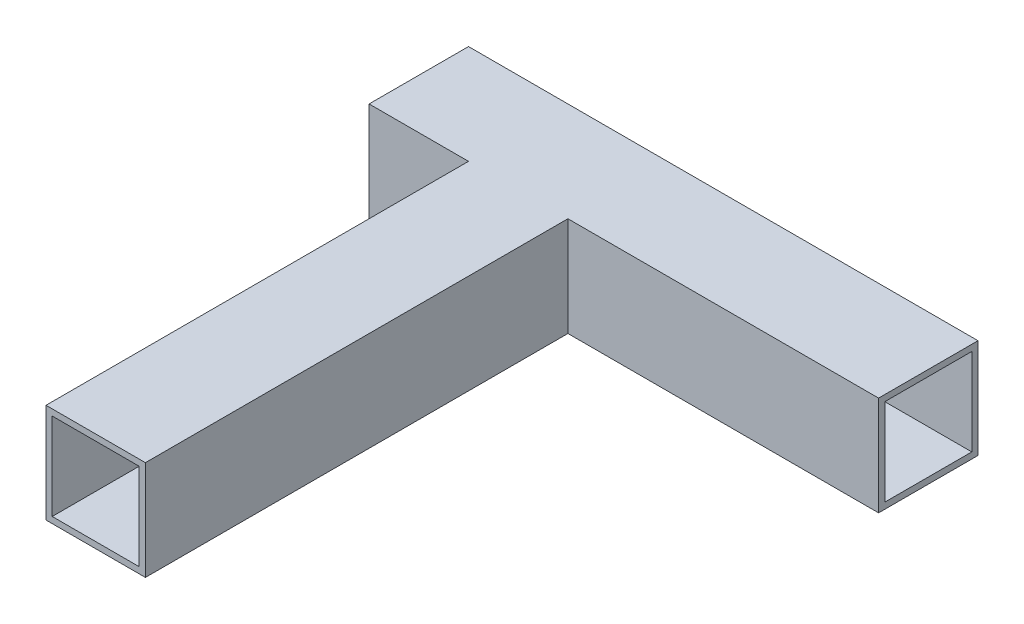
ISO-10303-21;
HEADER;
FILE_DESCRIPTION(('STEP AP214'),'2;1');
FILE_NAME('part.step','',(''),(''),'','','');
FILE_SCHEMA(('AUTOMOTIVE_DESIGN { 1 0 10303 214 1 1 1 1 }'));
ENDSEC;
DATA;
#1=APPLICATION_CONTEXT('core data for automotive mechanical design processes');
#2=APPLICATION_PROTOCOL_DEFINITION('international standard','automotive_design',2000,#1);
#3=PRODUCT_CONTEXT('',#1,'mechanical');
#4=PRODUCT('Part','Part','',(#3));
#5=PRODUCT_RELATED_PRODUCT_CATEGORY('part','',(#4));
#6=PRODUCT_DEFINITION_FORMATION('','',#4);
#7=PRODUCT_DEFINITION_CONTEXT('part definition',#1,'design');
#8=PRODUCT_DEFINITION('design','',#6,#7);
#9=PRODUCT_DEFINITION_SHAPE('','',#8);
#10=(LENGTH_UNIT() NAMED_UNIT(*) SI_UNIT(.MILLI.,.METRE.));
#11=(NAMED_UNIT(*) PLANE_ANGLE_UNIT() SI_UNIT($,.RADIAN.));
#12=(NAMED_UNIT(*) SI_UNIT($,.STERADIAN.) SOLID_ANGLE_UNIT());
#13=UNCERTAINTY_MEASURE_WITH_UNIT(LENGTH_MEASURE(1.E-05),#10,'distance_accuracy_value','');
#14=(GEOMETRIC_REPRESENTATION_CONTEXT(3) GLOBAL_UNCERTAINTY_ASSIGNED_CONTEXT((#13)) GLOBAL_UNIT_ASSIGNED_CONTEXT((#10,
#11,#12)) REPRESENTATION_CONTEXT('',''));
#15=CARTESIAN_POINT('',(0.,0.,0.));
#16=DIRECTION('',(0.,0.,1.));
#17=DIRECTION('',(1.,0.,0.));
#18=AXIS2_PLACEMENT_3D('',#15,#16,#17);
#19=CARTESIAN_POINT('',(0.,0.,241.3));
#20=DIRECTION('',(0.,0.,-1.));
#21=DIRECTION('',(-1.,0.,0.));
#22=AXIS2_PLACEMENT_3D('',#19,#20,#21);
#23=PLANE('',#22);
#24=DIRECTION('',(0.,1.,0.));
#25=VECTOR('',#24,1.);
#26=CARTESIAN_POINT('',(25.4,-25.4,241.3));
#27=LINE('',#26,#25);
#28=CARTESIAN_POINT('',(25.4,-25.4,241.3));
#29=VERTEX_POINT('',#28);
#30=CARTESIAN_POINT('',(25.4,25.4,241.3));
#31=VERTEX_POINT('',#30);
#32=EDGE_CURVE('E250',#29,#31,#27,.T.);
#33=ORIENTED_EDGE('',*,*,#32,.T.);
#34=DIRECTION('',(-1.,0.,0.));
#35=VECTOR('',#34,1.);
#36=CARTESIAN_POINT('',(-25.4,25.4,241.3));
#37=LINE('',#36,#35);
#38=CARTESIAN_POINT('',(-25.4,25.4,241.3));
#39=VERTEX_POINT('',#38);
#40=EDGE_CURVE('E253',#31,#39,#37,.T.);
#41=ORIENTED_EDGE('',*,*,#40,.T.);
#42=DIRECTION('',(0.,-1.,0.));
#43=VECTOR('',#42,1.);
#44=CARTESIAN_POINT('',(-25.4,-25.4,241.3));
#45=LINE('',#44,#43);
#46=CARTESIAN_POINT('',(-25.4,-25.4,241.3));
#47=VERTEX_POINT('',#46);
#48=EDGE_CURVE('E256',#39,#47,#45,.T.);
#49=ORIENTED_EDGE('',*,*,#48,.T.);
#50=DIRECTION('',(1.,0.,0.));
#51=VECTOR('',#50,1.);
#52=CARTESIAN_POINT('',(-25.4,-25.4,241.3));
#53=LINE('',#52,#51);
#54=EDGE_CURVE('E258',#47,#29,#53,.T.);
#55=ORIENTED_EDGE('',*,*,#54,.T.);
#56=EDGE_LOOP('',(#33,#41,#49,#55));
#57=FACE_BOUND('',#56,.T.);
#58=DIRECTION('',(0.,-1.,0.));
#59=VECTOR('',#58,1.);
#60=CARTESIAN_POINT('',(-22.225,-22.225,241.3));
#61=LINE('',#60,#59);
#62=CARTESIAN_POINT('',(-22.225,22.225,241.3));
#63=VERTEX_POINT('',#62);
#64=CARTESIAN_POINT('',(-22.225,-22.225,241.3));
#65=VERTEX_POINT('',#64);
#66=EDGE_CURVE('E224',#63,#65,#61,.T.);
#67=ORIENTED_EDGE('',*,*,#66,.F.);
#68=DIRECTION('',(-1.,0.,0.));
#69=VECTOR('',#68,1.);
#70=CARTESIAN_POINT('',(-22.225,22.225,241.3));
#71=LINE('',#70,#69);
#72=CARTESIAN_POINT('',(22.225,22.225,241.3));
#73=VERTEX_POINT('',#72);
#74=EDGE_CURVE('E231',#73,#63,#71,.T.);
#75=ORIENTED_EDGE('',*,*,#74,.F.);
#76=DIRECTION('',(0.,1.,0.));
#77=VECTOR('',#76,1.);
#78=CARTESIAN_POINT('',(22.225,-22.225,241.3));
#79=LINE('',#78,#77);
#80=CARTESIAN_POINT('',(22.225,-22.225,241.3));
#81=VERTEX_POINT('',#80);
#82=EDGE_CURVE('E229',#81,#73,#79,.T.);
#83=ORIENTED_EDGE('',*,*,#82,.F.);
#84=DIRECTION('',(1.,0.,0.));
#85=VECTOR('',#84,1.);
#86=CARTESIAN_POINT('',(-22.225,-22.225,241.3));
#87=LINE('',#86,#85);
#88=EDGE_CURVE('E226',#65,#81,#87,.T.);
#89=ORIENTED_EDGE('',*,*,#88,.F.);
#90=EDGE_LOOP('',(#67,#75,#83,#89));
#91=FACE_BOUND('',#90,.T.);
#92=ADVANCED_FACE('F34',(#57,#91),#23,.F.);
#93=CARTESIAN_POINT('',(25.4,-25.4,241.3));
#94=DIRECTION('',(-1.,0.,0.));
#95=DIRECTION('',(0.,0.,1.));
#96=AXIS2_PLACEMENT_3D('',#93,#94,#95);
#97=PLANE('',#96);
#98=DIRECTION('',(0.,1.,0.));
#99=VECTOR('',#98,1.);
#100=CARTESIAN_POINT('',(25.4,-25.4,25.4));
#101=LINE('',#100,#99);
#102=CARTESIAN_POINT('',(25.4000000000001,-25.4,25.4));
#103=VERTEX_POINT('',#102);
#104=CARTESIAN_POINT('',(25.4000000000001,25.4,25.4));
#105=VERTEX_POINT('',#104);
#106=EDGE_CURVE('E249',#103,#105,#101,.T.);
#107=ORIENTED_EDGE('',*,*,#106,.T.);
#108=DIRECTION('',(0.,0.,-1.));
#109=VECTOR('',#108,1.);
#110=CARTESIAN_POINT('',(25.4,25.4,241.3));
#111=LINE('',#110,#109);
#112=EDGE_CURVE('E11',#31,#105,#111,.T.);
#113=ORIENTED_EDGE('',*,*,#112,.F.);
#114=ORIENTED_EDGE('',*,*,#32,.F.);
#115=DIRECTION('',(0.,0.,-1.));
#116=VECTOR('',#115,1.);
#117=CARTESIAN_POINT('',(25.4,-25.4,241.3));
#118=LINE('',#117,#116);
#119=EDGE_CURVE('E260',#29,#103,#118,.T.);
#120=ORIENTED_EDGE('',*,*,#119,.T.);
#121=EDGE_LOOP('',(#107,#113,#114,#120));
#122=FACE_BOUND('',#121,.T.);
#123=ADVANCED_FACE('F36',(#122),#97,.F.);
#124=CARTESIAN_POINT('',(-25.4,25.4,241.3));
#125=DIRECTION('',(0.,-1.,0.));
#126=DIRECTION('',(0.,0.,-1.));
#127=AXIS2_PLACEMENT_3D('',#124,#125,#126);
#128=PLANE('',#127);
#129=ORIENTED_EDGE('',*,*,#112,.T.);
#130=DIRECTION('',(-1.,0.,0.));
#131=VECTOR('',#130,1.);
#132=CARTESIAN_POINT('',(184.15,25.4,25.4));
#133=LINE('',#132,#131);
#134=CARTESIAN_POINT('',(184.15,25.4,25.4));
#135=VERTEX_POINT('',#134);
#136=EDGE_CURVE('E219',#135,#105,#133,.T.);
#137=ORIENTED_EDGE('',*,*,#136,.F.);
#138=DIRECTION('',(0.,0.,1.));
#139=VECTOR('',#138,1.);
#140=CARTESIAN_POINT('',(184.15,25.4,25.4));
#141=LINE('',#140,#139);
#142=CARTESIAN_POINT('',(184.15,25.4,-25.4));
#143=VERTEX_POINT('',#142);
#144=EDGE_CURVE('E195',#143,#135,#141,.T.);
#145=ORIENTED_EDGE('',*,*,#144,.F.);
#146=DIRECTION('',(-1.,0.,0.));
#147=VECTOR('',#146,1.);
#148=CARTESIAN_POINT('',(184.15,25.4,-25.4));
#149=LINE('',#148,#147);
#150=CARTESIAN_POINT('',(-76.2000000000001,25.4,-25.4));
#151=VERTEX_POINT('',#150);
#152=EDGE_CURVE('E221',#143,#151,#149,.T.);
#153=ORIENTED_EDGE('',*,*,#152,.T.);
#154=DIRECTION('',(0.,0.,1.));
#155=VECTOR('',#154,1.);
#156=CARTESIAN_POINT('',(-76.2000000000001,25.4,25.4));
#157=LINE('',#156,#155);
#158=CARTESIAN_POINT('',(-76.2000000000001,25.4,25.4));
#159=VERTEX_POINT('',#158);
#160=EDGE_CURVE('E205',#151,#159,#157,.T.);
#161=ORIENTED_EDGE('',*,*,#160,.T.);
#162=CARTESIAN_POINT('',(-25.3999999999999,25.4,25.4));
#163=VERTEX_POINT('',#162);
#164=EDGE_CURVE('E218',#163,#159,#133,.T.);
#165=ORIENTED_EDGE('',*,*,#164,.F.);
#166=DIRECTION('',(0.,0.,-1.));
#167=VECTOR('',#166,1.);
#168=CARTESIAN_POINT('',(-25.4,25.4,241.3));
#169=LINE('',#168,#167);
#170=EDGE_CURVE('E42',#39,#163,#169,.T.);
#171=ORIENTED_EDGE('',*,*,#170,.F.);
#172=ORIENTED_EDGE('',*,*,#40,.F.);
#173=EDGE_LOOP('',(#129,#137,#145,#153,#161,#165,#171,#172));
#174=FACE_BOUND('',#173,.T.);
#175=ADVANCED_FACE('F277',(#174),#128,.F.);
#176=CARTESIAN_POINT('',(-25.4,-25.4,241.3));
#177=DIRECTION('',(1.,0.,0.));
#178=DIRECTION('',(0.,0.,-1.));
#179=AXIS2_PLACEMENT_3D('',#176,#177,#178);
#180=PLANE('',#179);
#181=DIRECTION('',(0.,-1.,0.));
#182=VECTOR('',#181,1.);
#183=CARTESIAN_POINT('',(-25.4,-25.4,25.4));
#184=LINE('',#183,#182);
#185=CARTESIAN_POINT('',(-25.4,-25.4,25.4));
#186=VERTEX_POINT('',#185);
#187=EDGE_CURVE('E254',#163,#186,#184,.T.);
#188=ORIENTED_EDGE('',*,*,#187,.T.);
#189=DIRECTION('',(0.,0.,-1.));
#190=VECTOR('',#189,1.);
#191=CARTESIAN_POINT('',(-25.4,-25.4,241.3));
#192=LINE('',#191,#190);
#193=EDGE_CURVE('E267',#47,#186,#192,.T.);
#194=ORIENTED_EDGE('',*,*,#193,.F.);
#195=ORIENTED_EDGE('',*,*,#48,.F.);
#196=ORIENTED_EDGE('',*,*,#170,.T.);
#197=EDGE_LOOP('',(#188,#194,#195,#196));
#198=FACE_BOUND('',#197,.T.);
#199=ADVANCED_FACE('F273',(#198),#180,.F.);
#200=CARTESIAN_POINT('',(-25.4,-25.4,241.3));
#201=DIRECTION('',(0.,1.,0.));
#202=DIRECTION('',(0.,0.,1.));
#203=AXIS2_PLACEMENT_3D('',#200,#201,#202);
#204=PLANE('',#203);
#205=ORIENTED_EDGE('',*,*,#193,.T.);
#206=DIRECTION('',(-1.,0.,0.));
#207=VECTOR('',#206,1.);
#208=CARTESIAN_POINT('',(184.15,-25.4,25.4));
#209=LINE('',#208,#207);
#210=CARTESIAN_POINT('',(-76.2000000000001,-25.4,25.4));
#211=VERTEX_POINT('',#210);
#212=EDGE_CURVE('E214',#186,#211,#209,.T.);
#213=ORIENTED_EDGE('',*,*,#212,.T.);
#214=DIRECTION('',(0.,0.,-1.));
#215=VECTOR('',#214,1.);
#216=CARTESIAN_POINT('',(-76.2000000000001,-25.4,25.4));
#217=LINE('',#216,#215);
#218=CARTESIAN_POINT('',(-76.2000000000001,-25.4,-25.4));
#219=VERTEX_POINT('',#218);
#220=EDGE_CURVE('E196',#211,#219,#217,.T.);
#221=ORIENTED_EDGE('',*,*,#220,.T.);
#222=DIRECTION('',(-1.,0.,0.));
#223=VECTOR('',#222,1.);
#224=CARTESIAN_POINT('',(184.15,-25.4,-25.4));
#225=LINE('',#224,#223);
#226=CARTESIAN_POINT('',(184.15,-25.4,-25.4));
#227=VERTEX_POINT('',#226);
#228=EDGE_CURVE('E202',#227,#219,#225,.T.);
#229=ORIENTED_EDGE('',*,*,#228,.F.);
#230=DIRECTION('',(0.,0.,-1.));
#231=VECTOR('',#230,1.);
#232=CARTESIAN_POINT('',(184.15,-25.4,25.4));
#233=LINE('',#232,#231);
#234=CARTESIAN_POINT('',(184.15,-25.4,25.4));
#235=VERTEX_POINT('',#234);
#236=EDGE_CURVE('E200',#235,#227,#233,.T.);
#237=ORIENTED_EDGE('',*,*,#236,.F.);
#238=EDGE_CURVE('E215',#235,#103,#209,.T.);
#239=ORIENTED_EDGE('',*,*,#238,.T.);
#240=ORIENTED_EDGE('',*,*,#119,.F.);
#241=ORIENTED_EDGE('',*,*,#54,.F.);
#242=EDGE_LOOP('',(#205,#213,#221,#229,#237,#239,#240,#241));
#243=FACE_BOUND('',#242,.T.);
#244=ADVANCED_FACE('F283',(#243),#204,.F.);
#245=CARTESIAN_POINT('',(-22.225,-22.225,241.3));
#246=DIRECTION('',(1.,0.,0.));
#247=DIRECTION('',(0.,0.,-1.));
#248=AXIS2_PLACEMENT_3D('',#245,#246,#247);
#249=PLANE('',#248);
#250=DIRECTION('',(0.,-1.,0.));
#251=VECTOR('',#250,1.);
#252=CARTESIAN_POINT('',(-22.225,-22.225,25.4));
#253=LINE('',#252,#251);
#254=CARTESIAN_POINT('',(-22.225,22.225,25.4));
#255=VERTEX_POINT('',#254);
#256=CARTESIAN_POINT('',(-22.225,-22.225,25.4));
#257=VERTEX_POINT('',#256);
#258=EDGE_CURVE('E57',#255,#257,#253,.T.);
#259=ORIENTED_EDGE('',*,*,#258,.F.);
#260=DIRECTION('',(0.,0.,-1.));
#261=VECTOR('',#260,1.);
#262=CARTESIAN_POINT('',(-22.225,22.225,241.3));
#263=LINE('',#262,#261);
#264=EDGE_CURVE('E233',#63,#255,#263,.T.);
#265=ORIENTED_EDGE('',*,*,#264,.F.);
#266=ORIENTED_EDGE('',*,*,#66,.T.);
#267=DIRECTION('',(0.,0.,-1.));
#268=VECTOR('',#267,1.);
#269=CARTESIAN_POINT('',(-22.225,-22.225,241.3));
#270=LINE('',#269,#268);
#271=EDGE_CURVE('E247',#65,#257,#270,.T.);
#272=ORIENTED_EDGE('',*,*,#271,.T.);
#273=EDGE_LOOP('',(#259,#265,#266,#272));
#274=FACE_BOUND('',#273,.T.);
#275=ADVANCED_FACE('F330',(#274),#249,.T.);
#276=CARTESIAN_POINT('',(-22.225,-22.225,241.3));
#277=DIRECTION('',(0.,1.,0.));
#278=DIRECTION('',(0.,0.,1.));
#279=AXIS2_PLACEMENT_3D('',#276,#277,#278);
#280=PLANE('',#279);
#281=DIRECTION('',(1.,0.,0.));
#282=VECTOR('',#281,1.);
#283=CARTESIAN_POINT('',(-22.225,-22.225,25.4));
#284=LINE('',#283,#282);
#285=CARTESIAN_POINT('',(22.225,-22.225,25.4));
#286=VERTEX_POINT('',#285);
#287=EDGE_CURVE('E235',#257,#286,#284,.T.);
#288=ORIENTED_EDGE('',*,*,#287,.F.);
#289=ORIENTED_EDGE('',*,*,#271,.F.);
#290=ORIENTED_EDGE('',*,*,#88,.T.);
#291=DIRECTION('',(0.,0.,-1.));
#292=VECTOR('',#291,1.);
#293=CARTESIAN_POINT('',(22.225,-22.225,241.3));
#294=LINE('',#293,#292);
#295=EDGE_CURVE('E245',#81,#286,#294,.T.);
#296=ORIENTED_EDGE('',*,*,#295,.T.);
#297=EDGE_LOOP('',(#288,#289,#290,#296));
#298=FACE_BOUND('',#297,.T.);
#299=ADVANCED_FACE('F348',(#298),#280,.T.);
#300=CARTESIAN_POINT('',(22.225,-22.225,241.3));
#301=DIRECTION('',(-1.,0.,0.));
#302=DIRECTION('',(0.,-1.,0.));
#303=AXIS2_PLACEMENT_3D('',#300,#301,#302);
#304=PLANE('',#303);
#305=DIRECTION('',(0.,1.,0.));
#306=VECTOR('',#305,1.);
#307=CARTESIAN_POINT('',(22.225,-22.225,25.4));
#308=LINE('',#307,#306);
#309=CARTESIAN_POINT('',(22.225,22.225,25.4));
#310=VERTEX_POINT('',#309);
#311=EDGE_CURVE('E238',#286,#310,#308,.T.);
#312=ORIENTED_EDGE('',*,*,#311,.F.);
#313=ORIENTED_EDGE('',*,*,#295,.F.);
#314=ORIENTED_EDGE('',*,*,#82,.T.);
#315=DIRECTION('',(0.,0.,-1.));
#316=VECTOR('',#315,1.);
#317=CARTESIAN_POINT('',(22.225,22.225,241.3));
#318=LINE('',#317,#316);
#319=EDGE_CURVE('E49',#73,#310,#318,.T.);
#320=ORIENTED_EDGE('',*,*,#319,.T.);
#321=EDGE_LOOP('',(#312,#313,#314,#320));
#322=FACE_BOUND('',#321,.T.);
#323=ADVANCED_FACE('F353',(#322),#304,.T.);
#324=CARTESIAN_POINT('',(-22.225,22.225,241.3));
#325=DIRECTION('',(0.,-1.,0.));
#326=DIRECTION('',(1.,0.,0.));
#327=AXIS2_PLACEMENT_3D('',#324,#325,#326);
#328=PLANE('',#327);
#329=DIRECTION('',(-1.,0.,0.));
#330=VECTOR('',#329,1.);
#331=CARTESIAN_POINT('',(-22.225,22.225,25.4));
#332=LINE('',#331,#330);
#333=EDGE_CURVE('E227',#310,#255,#332,.T.);
#334=ORIENTED_EDGE('',*,*,#333,.F.);
#335=ORIENTED_EDGE('',*,*,#319,.F.);
#336=ORIENTED_EDGE('',*,*,#74,.T.);
#337=ORIENTED_EDGE('',*,*,#264,.T.);
#338=EDGE_LOOP('',(#334,#335,#336,#337));
#339=FACE_BOUND('',#338,.T.);
#340=ADVANCED_FACE('F359',(#339),#328,.T.);
#341=CARTESIAN_POINT('',(184.15,-25.4,25.4));
#342=DIRECTION('',(0.,0.,-1.));
#343=DIRECTION('',(-1.,0.,0.));
#344=AXIS2_PLACEMENT_3D('',#341,#342,#343);
#345=PLANE('',#344);
#346=ORIENTED_EDGE('',*,*,#311,.T.);
#347=ORIENTED_EDGE('',*,*,#333,.T.);
#348=ORIENTED_EDGE('',*,*,#258,.T.);
#349=ORIENTED_EDGE('',*,*,#287,.T.);
#350=EDGE_LOOP('',(#346,#347,#348,#349));
#351=FACE_BOUND('',#350,.T.);
#352=ADVANCED_FACE('F366',(#351),#345,.F.);
#353=ORIENTED_EDGE('',*,*,#106,.F.);
#354=ORIENTED_EDGE('',*,*,#238,.F.);
#355=DIRECTION('',(0.,-1.,0.));
#356=VECTOR('',#355,1.);
#357=CARTESIAN_POINT('',(184.15,-25.4,25.4));
#358=LINE('',#357,#356);
#359=EDGE_CURVE('E198',#135,#235,#358,.T.);
#360=ORIENTED_EDGE('',*,*,#359,.F.);
#361=ORIENTED_EDGE('',*,*,#136,.T.);
#362=EDGE_LOOP('',(#353,#354,#360,#361));
#363=FACE_BOUND('',#362,.T.);
#364=ADVANCED_FACE('F296',(#363),#345,.F.);
#365=CARTESIAN_POINT('',(184.15,0.,0.));
#366=DIRECTION('',(-1.,0.,0.));
#367=DIRECTION('',(0.,0.,1.));
#368=AXIS2_PLACEMENT_3D('',#365,#366,#367);
#369=PLANE('',#368);
#370=DIRECTION('',(0.,1.,0.));
#371=VECTOR('',#370,1.);
#372=CARTESIAN_POINT('',(184.15,-25.4,-25.4));
#373=LINE('',#372,#371);
#374=EDGE_CURVE('E192',#227,#143,#373,.T.);
#375=ORIENTED_EDGE('',*,*,#374,.T.);
#376=ORIENTED_EDGE('',*,*,#144,.T.);
#377=ORIENTED_EDGE('',*,*,#359,.T.);
#378=ORIENTED_EDGE('',*,*,#236,.T.);
#379=EDGE_LOOP('',(#375,#376,#377,#378));
#380=FACE_BOUND('',#379,.T.);
#381=DIRECTION('',(0.,-1.,0.));
#382=VECTOR('',#381,1.);
#383=CARTESIAN_POINT('',(184.15,-22.225,22.225));
#384=LINE('',#383,#382);
#385=CARTESIAN_POINT('',(184.15,22.225,22.225));
#386=VERTEX_POINT('',#385);
#387=CARTESIAN_POINT('',(184.15,-22.225,22.225));
#388=VERTEX_POINT('',#387);
#389=EDGE_CURVE('E150',#386,#388,#384,.T.);
#390=ORIENTED_EDGE('',*,*,#389,.F.);
#391=DIRECTION('',(0.,0.,1.));
#392=VECTOR('',#391,1.);
#393=CARTESIAN_POINT('',(184.15,22.225,22.225));
#394=LINE('',#393,#392);
#395=CARTESIAN_POINT('',(184.15,22.225,-22.225));
#396=VERTEX_POINT('',#395);
#397=EDGE_CURVE('E176',#396,#386,#394,.T.);
#398=ORIENTED_EDGE('',*,*,#397,.F.);
#399=DIRECTION('',(0.,1.,0.));
#400=VECTOR('',#399,1.);
#401=CARTESIAN_POINT('',(184.15,-22.225,-22.225));
#402=LINE('',#401,#400);
#403=CARTESIAN_POINT('',(184.15,-22.225,-22.225));
#404=VERTEX_POINT('',#403);
#405=EDGE_CURVE('E174',#404,#396,#402,.T.);
#406=ORIENTED_EDGE('',*,*,#405,.F.);
#407=DIRECTION('',(0.,0.,-1.));
#408=VECTOR('',#407,1.);
#409=CARTESIAN_POINT('',(184.15,-22.225,22.225));
#410=LINE('',#409,#408);
#411=EDGE_CURVE('E160',#388,#404,#410,.T.);
#412=ORIENTED_EDGE('',*,*,#411,.F.);
#413=EDGE_LOOP('',(#390,#398,#406,#412));
#414=FACE_BOUND('',#413,.T.);
#415=ADVANCED_FACE('F172',(#380,#414),#369,.F.);
#416=CARTESIAN_POINT('',(-76.2000000000001,0.,0.));
#417=DIRECTION('',(-1.,0.,0.));
#418=DIRECTION('',(0.,0.,1.));
#419=AXIS2_PLACEMENT_3D('',#416,#417,#418);
#420=PLANE('',#419);
#421=DIRECTION('',(0.,1.,0.));
#422=VECTOR('',#421,1.);
#423=CARTESIAN_POINT('',(-76.2000000000001,-25.4,-25.4));
#424=LINE('',#423,#422);
#425=EDGE_CURVE('E168',#219,#151,#424,.T.);
#426=ORIENTED_EDGE('',*,*,#425,.F.);
#427=ORIENTED_EDGE('',*,*,#220,.F.);
#428=DIRECTION('',(0.,-1.,0.));
#429=VECTOR('',#428,1.);
#430=CARTESIAN_POINT('',(-76.2000000000001,-25.4,25.4));
#431=LINE('',#430,#429);
#432=EDGE_CURVE('E208',#159,#211,#431,.T.);
#433=ORIENTED_EDGE('',*,*,#432,.F.);
#434=ORIENTED_EDGE('',*,*,#160,.F.);
#435=EDGE_LOOP('',(#426,#427,#433,#434));
#436=FACE_BOUND('',#435,.T.);
#437=DIRECTION('',(0.,0.,1.));
#438=VECTOR('',#437,1.);
#439=CARTESIAN_POINT('',(-76.2000000000001,22.225,22.225));
#440=LINE('',#439,#438);
#441=CARTESIAN_POINT('',(-76.2000000000001,22.225,-22.225));
#442=VERTEX_POINT('',#441);
#443=CARTESIAN_POINT('',(-76.2000000000001,22.225,22.225));
#444=VERTEX_POINT('',#443);
#445=EDGE_CURVE('E161',#442,#444,#440,.T.);
#446=ORIENTED_EDGE('',*,*,#445,.T.);
#447=DIRECTION('',(0.,-1.,0.));
#448=VECTOR('',#447,1.);
#449=CARTESIAN_POINT('',(-76.2000000000001,-22.225,22.225));
#450=LINE('',#449,#448);
#451=CARTESIAN_POINT('',(-76.2000000000001,-22.225,22.225));
#452=VERTEX_POINT('',#451);
#453=EDGE_CURVE('E180',#444,#452,#450,.T.);
#454=ORIENTED_EDGE('',*,*,#453,.T.);
#455=DIRECTION('',(0.,0.,-1.));
#456=VECTOR('',#455,1.);
#457=CARTESIAN_POINT('',(-76.2000000000001,-22.225,22.225));
#458=LINE('',#457,#456);
#459=CARTESIAN_POINT('',(-76.2000000000001,-22.225,-22.225));
#460=VERTEX_POINT('',#459);
#461=EDGE_CURVE('E167',#452,#460,#458,.T.);
#462=ORIENTED_EDGE('',*,*,#461,.T.);
#463=DIRECTION('',(0.,1.,0.));
#464=VECTOR('',#463,1.);
#465=CARTESIAN_POINT('',(-76.2000000000001,-22.225,-22.225));
#466=LINE('',#465,#464);
#467=EDGE_CURVE('E183',#460,#442,#466,.T.);
#468=ORIENTED_EDGE('',*,*,#467,.T.);
#469=EDGE_LOOP('',(#446,#454,#462,#468));
#470=FACE_BOUND('',#469,.T.);
#471=ADVANCED_FACE('F305',(#436,#470),#420,.T.);
#472=CARTESIAN_POINT('',(184.15,-25.4,-25.4));
#473=DIRECTION('',(0.,0.,1.));
#474=DIRECTION('',(1.,0.,0.));
#475=AXIS2_PLACEMENT_3D('',#472,#473,#474);
#476=PLANE('',#475);
#477=ORIENTED_EDGE('',*,*,#425,.T.);
#478=ORIENTED_EDGE('',*,*,#152,.F.);
#479=ORIENTED_EDGE('',*,*,#374,.F.);
#480=ORIENTED_EDGE('',*,*,#228,.T.);
#481=EDGE_LOOP('',(#477,#478,#479,#480));
#482=FACE_BOUND('',#481,.T.);
#483=ADVANCED_FACE('F302',(#482),#476,.F.);
#484=ORIENTED_EDGE('',*,*,#187,.F.);
#485=ORIENTED_EDGE('',*,*,#164,.T.);
#486=ORIENTED_EDGE('',*,*,#432,.T.);
#487=ORIENTED_EDGE('',*,*,#212,.F.);
#488=EDGE_LOOP('',(#484,#485,#486,#487));
#489=FACE_BOUND('',#488,.T.);
#490=ADVANCED_FACE('F280',(#489),#345,.F.);
#491=CARTESIAN_POINT('',(184.15,-22.225,22.225));
#492=DIRECTION('',(0.,0.,-1.));
#493=DIRECTION('',(-1.,0.,0.));
#494=AXIS2_PLACEMENT_3D('',#491,#492,#493);
#495=PLANE('',#494);
#496=ORIENTED_EDGE('',*,*,#453,.F.);
#497=DIRECTION('',(-1.,0.,0.));
#498=VECTOR('',#497,1.);
#499=CARTESIAN_POINT('',(184.15,22.225,22.225));
#500=LINE('',#499,#498);
#501=EDGE_CURVE('E156',#386,#444,#500,.T.);
#502=ORIENTED_EDGE('',*,*,#501,.F.);
#503=ORIENTED_EDGE('',*,*,#389,.T.);
#504=DIRECTION('',(-1.,0.,0.));
#505=VECTOR('',#504,1.);
#506=CARTESIAN_POINT('',(184.15,-22.225,22.225));
#507=LINE('',#506,#505);
#508=EDGE_CURVE('E153',#388,#452,#507,.T.);
#509=ORIENTED_EDGE('',*,*,#508,.T.);
#510=EDGE_LOOP('',(#496,#502,#503,#509));
#511=FACE_BOUND('',#510,.T.);
#512=ADVANCED_FACE('F152',(#511),#495,.T.);
#513=CARTESIAN_POINT('',(184.15,-22.225,22.225));
#514=DIRECTION('',(0.,1.,0.));
#515=DIRECTION('',(1.,0.,0.));
#516=AXIS2_PLACEMENT_3D('',#513,#514,#515);
#517=PLANE('',#516);
#518=ORIENTED_EDGE('',*,*,#461,.F.);
#519=ORIENTED_EDGE('',*,*,#508,.F.);
#520=ORIENTED_EDGE('',*,*,#411,.T.);
#521=DIRECTION('',(-1.,0.,0.));
#522=VECTOR('',#521,1.);
#523=CARTESIAN_POINT('',(184.15,-22.225,-22.225));
#524=LINE('',#523,#522);
#525=EDGE_CURVE('E169',#404,#460,#524,.T.);
#526=ORIENTED_EDGE('',*,*,#525,.T.);
#527=EDGE_LOOP('',(#518,#519,#520,#526));
#528=FACE_BOUND('',#527,.T.);
#529=ADVANCED_FACE('F164',(#528),#517,.T.);
#530=CARTESIAN_POINT('',(184.15,-22.225,-22.225));
#531=DIRECTION('',(0.,0.,1.));
#532=DIRECTION('',(0.,-1.,0.));
#533=AXIS2_PLACEMENT_3D('',#530,#531,#532);
#534=PLANE('',#533);
#535=ORIENTED_EDGE('',*,*,#467,.F.);
#536=ORIENTED_EDGE('',*,*,#525,.F.);
#537=ORIENTED_EDGE('',*,*,#405,.T.);
#538=DIRECTION('',(-1.,0.,0.));
#539=VECTOR('',#538,1.);
#540=CARTESIAN_POINT('',(184.15,22.225,-22.225));
#541=LINE('',#540,#539);
#542=EDGE_CURVE('E189',#396,#442,#541,.T.);
#543=ORIENTED_EDGE('',*,*,#542,.T.);
#544=EDGE_LOOP('',(#535,#536,#537,#543));
#545=FACE_BOUND('',#544,.T.);
#546=ADVANCED_FACE('F314',(#545),#534,.T.);
#547=CARTESIAN_POINT('',(184.15,22.225,22.225));
#548=DIRECTION('',(0.,-1.,0.));
#549=DIRECTION('',(0.,0.,-1.));
#550=AXIS2_PLACEMENT_3D('',#547,#548,#549);
#551=PLANE('',#550);
#552=ORIENTED_EDGE('',*,*,#445,.F.);
#553=ORIENTED_EDGE('',*,*,#542,.F.);
#554=ORIENTED_EDGE('',*,*,#397,.T.);
#555=ORIENTED_EDGE('',*,*,#501,.T.);
#556=EDGE_LOOP('',(#552,#553,#554,#555));
#557=FACE_BOUND('',#556,.T.);
#558=ADVANCED_FACE('F312',(#557),#551,.T.);
#559=CLOSED_SHELL('',(#92,#123,#175,#199,#244,#275,#299,#323,#340,#352,#364,#415,#471,#483,#490,
#512,#529,#546,#558));
#560=MANIFOLD_SOLID_BREP('B2',#559);
#561=ADVANCED_BREP_SHAPE_REPRESENTATION('',(#18,#560),#14);
#562=SHAPE_DEFINITION_REPRESENTATION(#9,#561);
ENDSEC;
END-ISO-10303-21;
